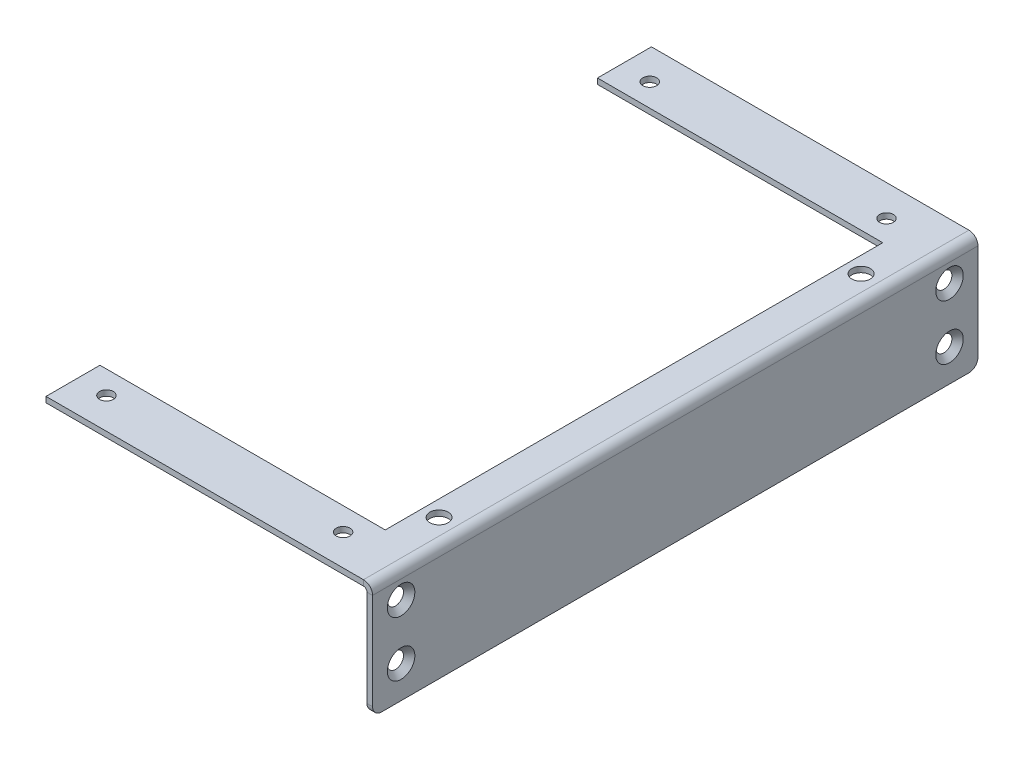
ISO-10303-21;
HEADER;
FILE_DESCRIPTION(('STEP AP214'),'2;1');
FILE_NAME('part.step','',(''),(''),'','','');
FILE_SCHEMA(('AUTOMOTIVE_DESIGN { 1 0 10303 214 1 1 1 1 }'));
ENDSEC;
DATA;
#1=APPLICATION_CONTEXT('core data for automotive mechanical design processes');
#2=APPLICATION_PROTOCOL_DEFINITION('international standard','automotive_design',2000,#1);
#3=PRODUCT_CONTEXT('',#1,'mechanical');
#4=PRODUCT('Part','Part','',(#3));
#5=PRODUCT_RELATED_PRODUCT_CATEGORY('part','',(#4));
#6=PRODUCT_DEFINITION_FORMATION('','',#4);
#7=PRODUCT_DEFINITION_CONTEXT('part definition',#1,'design');
#8=PRODUCT_DEFINITION('design','',#6,#7);
#9=PRODUCT_DEFINITION_SHAPE('','',#8);
#10=(LENGTH_UNIT() NAMED_UNIT(*) SI_UNIT(.MILLI.,.METRE.));
#11=(NAMED_UNIT(*) PLANE_ANGLE_UNIT() SI_UNIT($,.RADIAN.));
#12=(NAMED_UNIT(*) SI_UNIT($,.STERADIAN.) SOLID_ANGLE_UNIT());
#13=UNCERTAINTY_MEASURE_WITH_UNIT(LENGTH_MEASURE(1.E-05),#10,'distance_accuracy_value','');
#14=(GEOMETRIC_REPRESENTATION_CONTEXT(3) GLOBAL_UNCERTAINTY_ASSIGNED_CONTEXT((#13)) GLOBAL_UNIT_ASSIGNED_CONTEXT((#10,
#11,#12)) REPRESENTATION_CONTEXT('',''));
#15=CARTESIAN_POINT('',(0.,0.,0.));
#16=DIRECTION('',(0.,0.,1.));
#17=DIRECTION('',(1.,0.,0.));
#18=AXIS2_PLACEMENT_3D('',#15,#16,#17);
#19=CARTESIAN_POINT('',(71.2200000000001,-24.9792,-132.04));
#20=DIRECTION('',(0.,0.,-1.));
#21=DIRECTION('',(-1.,0.,0.));
#22=AXIS2_PLACEMENT_3D('',#19,#20,#21);
#23=PLANE('',#22);
#24=DIRECTION('',(0.,-1.,0.));
#25=VECTOR('',#24,1.);
#26=CARTESIAN_POINT('',(71.2200000000001,-24.9792,-132.04));
#27=LINE('',#26,#25);
#28=CARTESIAN_POINT('',(71.22,-1.9792,-132.04));
#29=VERTEX_POINT('',#28);
#30=CARTESIAN_POINT('',(71.2200000000001,-22.9992,-132.04));
#31=VERTEX_POINT('',#30);
#32=EDGE_CURVE('E179',#29,#31,#27,.T.);
#33=ORIENTED_EDGE('',*,*,#32,.T.);
#34=DIRECTION('',(1.,0.,0.));
#35=VECTOR('',#34,1.);
#36=CARTESIAN_POINT('',(-0.00100000000005651,-22.9992000000003,-132.04));
#37=LINE('',#36,#35);
#38=CARTESIAN_POINT('',(70.0008000000001,-22.9992,-132.04));
#39=VERTEX_POINT('',#38);
#40=EDGE_CURVE('E278',#39,#31,#37,.T.);
#41=ORIENTED_EDGE('',*,*,#40,.F.);
#42=DIRECTION('',(0.,1.,0.));
#43=VECTOR('',#42,1.);
#44=CARTESIAN_POINT('',(70.0008,2.4958991102842E-13,-132.04));
#45=LINE('',#44,#43);
#46=CARTESIAN_POINT('',(70.0008,-1.97920000000001,-132.04));
#47=VERTEX_POINT('',#46);
#48=EDGE_CURVE('E191',#47,#39,#45,.F.);
#49=ORIENTED_EDGE('',*,*,#48,.F.);
#50=DIRECTION('',(1.,0.,0.));
#51=VECTOR('',#50,1.);
#52=CARTESIAN_POINT('',(71.22,-1.9792,-132.04));
#53=LINE('',#52,#51);
#54=EDGE_CURVE('E202',#47,#29,#53,.T.);
#55=ORIENTED_EDGE('',*,*,#54,.T.);
#56=EDGE_LOOP('',(#33,#41,#49,#55));
#57=FACE_BOUND('',#56,.T.);
#58=ADVANCED_FACE('F58',(#57),#23,.T.);
#59=CARTESIAN_POINT('',(71.22,2.53846725076738E-13,0.));
#60=DIRECTION('',(1.,0.,0.));
#61=DIRECTION('',(0.,1.,0.));
#62=AXIS2_PLACEMENT_3D('',#59,#60,#61);
#63=PLANE('',#62);
#64=CARTESIAN_POINT('',(71.22,-5.9492,-6.22));
#65=DIRECTION('',(1.,0.,0.));
#66=DIRECTION('',(0.,0.,-1.));
#67=AXIS2_PLACEMENT_3D('',#64,#65,#66);
#68=CIRCLE('',#67,3.);
#69=CARTESIAN_POINT('',(71.22,-5.9492,-9.22));
#70=VERTEX_POINT('',#69);
#71=EDGE_CURVE('E348',#70,#70,#68,.T.);
#72=ORIENTED_EDGE('',*,*,#71,.F.);
#73=EDGE_LOOP('',(#72));
#74=FACE_BOUND('',#73,.T.);
#75=CARTESIAN_POINT('',(71.2200000000001,-17.9492,-6.21999999999999));
#76=DIRECTION('',(1.,0.,0.));
#77=DIRECTION('',(0.,0.,-1.));
#78=AXIS2_PLACEMENT_3D('',#75,#76,#77);
#79=CIRCLE('',#78,3.);
#80=CARTESIAN_POINT('',(71.2200000000001,-17.9492,-9.21999999999999));
#81=VERTEX_POINT('',#80);
#82=EDGE_CURVE('E342',#81,#81,#79,.T.);
#83=ORIENTED_EDGE('',*,*,#82,.F.);
#84=EDGE_LOOP('',(#83));
#85=FACE_BOUND('',#84,.T.);
#86=CARTESIAN_POINT('',(71.22,-5.9492,-125.82));
#87=DIRECTION('',(1.,0.,0.));
#88=DIRECTION('',(0.,0.,-1.));
#89=AXIS2_PLACEMENT_3D('',#86,#87,#88);
#90=CIRCLE('',#89,3.);
#91=CARTESIAN_POINT('',(71.22,-5.9492,-128.82));
#92=VERTEX_POINT('',#91);
#93=EDGE_CURVE('E339',#92,#92,#90,.T.);
#94=ORIENTED_EDGE('',*,*,#93,.F.);
#95=EDGE_LOOP('',(#94));
#96=FACE_BOUND('',#95,.T.);
#97=CARTESIAN_POINT('',(71.22,-17.9492,-125.82));
#98=DIRECTION('',(1.,0.,0.));
#99=DIRECTION('',(0.,0.,-1.));
#100=AXIS2_PLACEMENT_3D('',#97,#98,#99);
#101=CIRCLE('',#100,3.);
#102=CARTESIAN_POINT('',(71.22,-17.9492,-128.82));
#103=VERTEX_POINT('',#102);
#104=EDGE_CURVE('E331',#103,#103,#101,.T.);
#105=ORIENTED_EDGE('',*,*,#104,.F.);
#106=EDGE_LOOP('',(#105));
#107=FACE_BOUND('',#106,.T.);
#108=CARTESIAN_POINT('',(71.2200000000001,-22.9992,-1.98));
#109=DIRECTION('',(-1.,0.,0.));
#110=DIRECTION('',(0.,1.,0.));
#111=AXIS2_PLACEMENT_3D('',#108,#109,#110);
#112=CIRCLE('',#111,1.97999999999998);
#113=CARTESIAN_POINT('',(71.2200000000001,-24.9792,-1.98));
#114=VERTEX_POINT('',#113);
#115=CARTESIAN_POINT('',(71.2200000000001,-22.9992,0.));
#116=VERTEX_POINT('',#115);
#117=EDGE_CURVE('E161',#114,#116,#112,.T.);
#118=ORIENTED_EDGE('',*,*,#117,.F.);
#119=DIRECTION('',(0.,0.,1.));
#120=VECTOR('',#119,1.);
#121=CARTESIAN_POINT('',(71.2200000000001,-24.9792,0.));
#122=LINE('',#121,#120);
#123=CARTESIAN_POINT('',(71.2200000000001,-24.9792,-130.06));
#124=VERTEX_POINT('',#123);
#125=EDGE_CURVE('E173',#124,#114,#122,.T.);
#126=ORIENTED_EDGE('',*,*,#125,.F.);
#127=CARTESIAN_POINT('',(71.2200000000001,-22.9992,-130.06));
#128=DIRECTION('',(-1.,0.,0.));
#129=DIRECTION('',(0.,1.,0.));
#130=AXIS2_PLACEMENT_3D('',#127,#128,#129);
#131=CIRCLE('',#130,1.98000000000001);
#132=EDGE_CURVE('E75',#31,#124,#131,.T.);
#133=ORIENTED_EDGE('',*,*,#132,.F.);
#134=ORIENTED_EDGE('',*,*,#32,.F.);
#135=DIRECTION('',(0.,0.,1.));
#136=VECTOR('',#135,1.);
#137=CARTESIAN_POINT('',(71.22,-1.97920000000001,0.));
#138=LINE('',#137,#136);
#139=CARTESIAN_POINT('',(71.22,-1.97920000000001,0.));
#140=VERTEX_POINT('',#139);
#141=EDGE_CURVE('E194',#29,#140,#138,.T.);
#142=ORIENTED_EDGE('',*,*,#141,.T.);
#143=DIRECTION('',(0.,1.,0.));
#144=VECTOR('',#143,1.);
#145=CARTESIAN_POINT('',(71.22,-1.2192,0.));
#146=LINE('',#145,#144);
#147=EDGE_CURVE('E175',#116,#140,#146,.T.);
#148=ORIENTED_EDGE('',*,*,#147,.F.);
#149=EDGE_LOOP('',(#118,#126,#133,#134,#142,#148));
#150=FACE_BOUND('',#149,.T.);
#151=ADVANCED_FACE('F172',(#74,#85,#96,#107,#150),#63,.T.);
#152=CARTESIAN_POINT('',(70.0008,2.49589911028421E-13,0.));
#153=DIRECTION('',(1.,0.,0.));
#154=DIRECTION('',(0.,1.,0.));
#155=AXIS2_PLACEMENT_3D('',#152,#153,#154);
#156=PLANE('',#155);
#157=CARTESIAN_POINT('',(70.0008,-5.9492,-6.22));
#158=DIRECTION('',(1.,0.,0.));
#159=DIRECTION('',(0.,1.,0.));
#160=AXIS2_PLACEMENT_3D('',#157,#158,#159);
#161=CIRCLE('',#160,1.73748144142652);
#162=CARTESIAN_POINT('',(70.0008,-4.21171855857348,-6.22));
#163=VERTEX_POINT('',#162);
#164=EDGE_CURVE('E345',#163,#163,#161,.T.);
#165=ORIENTED_EDGE('',*,*,#164,.T.);
#166=EDGE_LOOP('',(#165));
#167=FACE_BOUND('',#166,.T.);
#168=CARTESIAN_POINT('',(70.0008000000001,-17.9492,-6.21999999999999));
#169=DIRECTION('',(1.,0.,0.));
#170=DIRECTION('',(0.,1.,0.));
#171=AXIS2_PLACEMENT_3D('',#168,#169,#170);
#172=CIRCLE('',#171,1.7374814414265);
#173=CARTESIAN_POINT('',(70.0008000000001,-16.2117185585735,-6.21999999999999));
#174=VERTEX_POINT('',#173);
#175=EDGE_CURVE('E62',#174,#174,#172,.T.);
#176=ORIENTED_EDGE('',*,*,#175,.T.);
#177=EDGE_LOOP('',(#176));
#178=FACE_BOUND('',#177,.T.);
#179=CARTESIAN_POINT('',(70.0008,-5.9492,-125.82));
#180=DIRECTION('',(1.,0.,0.));
#181=DIRECTION('',(0.,1.,0.));
#182=AXIS2_PLACEMENT_3D('',#179,#180,#181);
#183=CIRCLE('',#182,1.73748144142653);
#184=CARTESIAN_POINT('',(70.0008,-4.21171855857347,-125.82));
#185=VERTEX_POINT('',#184);
#186=EDGE_CURVE('E336',#185,#185,#183,.T.);
#187=ORIENTED_EDGE('',*,*,#186,.T.);
#188=EDGE_LOOP('',(#187));
#189=FACE_BOUND('',#188,.T.);
#190=CARTESIAN_POINT('',(70.0008,-17.9492,-125.82));
#191=DIRECTION('',(1.,0.,0.));
#192=DIRECTION('',(0.,1.,0.));
#193=AXIS2_PLACEMENT_3D('',#190,#191,#192);
#194=CIRCLE('',#193,1.73748144142653);
#195=CARTESIAN_POINT('',(70.0008,-16.2117185585735,-125.82));
#196=VERTEX_POINT('',#195);
#197=EDGE_CURVE('E327',#196,#196,#194,.T.);
#198=ORIENTED_EDGE('',*,*,#197,.T.);
#199=EDGE_LOOP('',(#198));
#200=FACE_BOUND('',#199,.T.);
#201=DIRECTION('',(0.,0.,-1.));
#202=VECTOR('',#201,1.);
#203=CARTESIAN_POINT('',(70.0008000000001,-24.9792,0.));
#204=LINE('',#203,#202);
#205=CARTESIAN_POINT('',(70.0008000000001,-24.9792,-130.06));
#206=VERTEX_POINT('',#205);
#207=CARTESIAN_POINT('',(70.0008000000001,-24.9792,-1.98));
#208=VERTEX_POINT('',#207);
#209=EDGE_CURVE('E189',#206,#208,#204,.F.);
#210=ORIENTED_EDGE('',*,*,#209,.T.);
#211=CARTESIAN_POINT('',(70.0008000000001,-22.9992,-1.98));
#212=DIRECTION('',(1.,0.,0.));
#213=DIRECTION('',(0.,1.,0.));
#214=AXIS2_PLACEMENT_3D('',#211,#212,#213);
#215=CIRCLE('',#214,1.97999999999998);
#216=CARTESIAN_POINT('',(70.0008000000001,-22.9992,0.));
#217=VERTEX_POINT('',#216);
#218=EDGE_CURVE('E83',#217,#208,#215,.T.);
#219=ORIENTED_EDGE('',*,*,#218,.F.);
#220=DIRECTION('',(0.,-1.,0.));
#221=VECTOR('',#220,1.);
#222=CARTESIAN_POINT('',(70.0008,2.49589911028421E-13,0.));
#223=LINE('',#222,#221);
#224=CARTESIAN_POINT('',(70.0008,-1.97920000000001,0.));
#225=VERTEX_POINT('',#224);
#226=EDGE_CURVE('E184',#217,#225,#223,.F.);
#227=ORIENTED_EDGE('',*,*,#226,.T.);
#228=DIRECTION('',(0.,0.,-1.));
#229=VECTOR('',#228,1.);
#230=CARTESIAN_POINT('',(70.0008,-1.9792,-132.04));
#231=LINE('',#230,#229);
#232=EDGE_CURVE('E199',#47,#225,#231,.F.);
#233=ORIENTED_EDGE('',*,*,#232,.F.);
#234=ORIENTED_EDGE('',*,*,#48,.T.);
#235=CARTESIAN_POINT('',(70.0008000000001,-22.9992,-130.06));
#236=DIRECTION('',(1.,0.,0.));
#237=DIRECTION('',(0.,1.,0.));
#238=AXIS2_PLACEMENT_3D('',#235,#236,#237);
#239=CIRCLE('',#238,1.98000000000001);
#240=EDGE_CURVE('E283',#206,#39,#239,.T.);
#241=ORIENTED_EDGE('',*,*,#240,.F.);
#242=EDGE_LOOP('',(#210,#219,#227,#233,#234,#241));
#243=FACE_BOUND('',#242,.T.);
#244=ADVANCED_FACE('F282',(#167,#178,#189,#200,#243),#156,.F.);
#245=CARTESIAN_POINT('',(71.2200000000001,-24.9792,0.));
#246=DIRECTION('',(0.,-1.,0.));
#247=DIRECTION('',(1.,0.,0.));
#248=AXIS2_PLACEMENT_3D('',#245,#246,#247);
#249=PLANE('',#248);
#250=ORIENTED_EDGE('',*,*,#125,.T.);
#251=DIRECTION('',(1.,0.,0.));
#252=VECTOR('',#251,1.);
#253=CARTESIAN_POINT('',(-0.00100000000002876,-24.9792000000003,-1.97999999999998));
#254=LINE('',#253,#252);
#255=EDGE_CURVE('E158',#208,#114,#254,.T.);
#256=ORIENTED_EDGE('',*,*,#255,.F.);
#257=ORIENTED_EDGE('',*,*,#209,.F.);
#258=DIRECTION('',(1.,0.,0.));
#259=VECTOR('',#258,1.);
#260=CARTESIAN_POINT('',(-0.00100000000005651,-24.9792000000003,-130.06));
#261=LINE('',#260,#259);
#262=EDGE_CURVE('E178',#206,#124,#261,.T.);
#263=ORIENTED_EDGE('',*,*,#262,.T.);
#264=EDGE_LOOP('',(#250,#256,#257,#263));
#265=FACE_BOUND('',#264,.T.);
#266=ADVANCED_FACE('F177',(#265),#249,.T.);
#267=CARTESIAN_POINT('',(0.,0.,0.));
#268=DIRECTION('',(0.,-1.,0.));
#269=DIRECTION('',(0.,0.,-1.));
#270=AXIS2_PLACEMENT_3D('',#267,#268,#269);
#271=PLANE('',#270);
#272=CARTESIAN_POINT('',(65.72,0.,-112.04));
#273=DIRECTION('',(0.,1.,0.));
#274=DIRECTION('',(0.,0.,1.));
#275=AXIS2_PLACEMENT_3D('',#272,#273,#274);
#276=CIRCLE('',#275,1.99999999999999);
#277=CARTESIAN_POINT('',(65.72,0.,-110.04));
#278=VERTEX_POINT('',#277);
#279=EDGE_CURVE('E390',#278,#278,#276,.T.);
#280=ORIENTED_EDGE('',*,*,#279,.F.);
#281=EDGE_LOOP('',(#280));
#282=FACE_BOUND('',#281,.T.);
#283=CARTESIAN_POINT('',(65.72,0.,-20.));
#284=DIRECTION('',(0.,1.,0.));
#285=DIRECTION('',(0.,0.,1.));
#286=AXIS2_PLACEMENT_3D('',#283,#284,#285);
#287=CIRCLE('',#286,1.99999999999999);
#288=CARTESIAN_POINT('',(65.72,0.,-18.));
#289=VERTEX_POINT('',#288);
#290=EDGE_CURVE('E384',#289,#289,#287,.T.);
#291=ORIENTED_EDGE('',*,*,#290,.F.);
#292=EDGE_LOOP('',(#291));
#293=FACE_BOUND('',#292,.T.);
#294=CARTESIAN_POINT('',(6.40999999999997,0.,-125.27));
#295=DIRECTION('',(0.,1.,0.));
#296=DIRECTION('',(0.,0.,1.));
#297=AXIS2_PLACEMENT_3D('',#294,#295,#296);
#298=CIRCLE('',#297,1.49999999999999);
#299=CARTESIAN_POINT('',(6.40999999999997,0.,-123.77));
#300=VERTEX_POINT('',#299);
#301=EDGE_CURVE('E372',#300,#300,#298,.T.);
#302=ORIENTED_EDGE('',*,*,#301,.F.);
#303=EDGE_LOOP('',(#302));
#304=FACE_BOUND('',#303,.T.);
#305=CARTESIAN_POINT('',(58.03,0.,-6.77));
#306=DIRECTION('',(0.,1.,0.));
#307=DIRECTION('',(0.,0.,1.));
#308=AXIS2_PLACEMENT_3D('',#305,#306,#307);
#309=CIRCLE('',#308,1.49999999999999);
#310=CARTESIAN_POINT('',(58.03,0.,-5.27000000000001));
#311=VERTEX_POINT('',#310);
#312=EDGE_CURVE('E360',#311,#311,#309,.T.);
#313=ORIENTED_EDGE('',*,*,#312,.F.);
#314=EDGE_LOOP('',(#313));
#315=FACE_BOUND('',#314,.T.);
#316=CARTESIAN_POINT('',(6.40999999999999,0.,-6.77));
#317=DIRECTION('',(0.,1.,0.));
#318=DIRECTION('',(0.,0.,1.));
#319=AXIS2_PLACEMENT_3D('',#316,#317,#318);
#320=CIRCLE('',#319,1.49999999999999);
#321=CARTESIAN_POINT('',(6.40999999999999,0.,-5.27000000000001));
#322=VERTEX_POINT('',#321);
#323=EDGE_CURVE('E354',#322,#322,#320,.T.);
#324=ORIENTED_EDGE('',*,*,#323,.F.);
#325=EDGE_LOOP('',(#324));
#326=FACE_BOUND('',#325,.T.);
#327=DIRECTION('',(0.,0.,1.));
#328=VECTOR('',#327,1.);
#329=CARTESIAN_POINT('',(0.,0.,0.));
#330=LINE('',#329,#328);
#331=CARTESIAN_POINT('',(0.,0.,-132.04));
#332=VERTEX_POINT('',#331);
#333=CARTESIAN_POINT('',(0.,0.,-120.27));
#334=VERTEX_POINT('',#333);
#335=EDGE_CURVE('E237',#332,#334,#330,.T.);
#336=ORIENTED_EDGE('',*,*,#335,.T.);
#337=DIRECTION('',(-1.,0.,0.));
#338=VECTOR('',#337,1.);
#339=CARTESIAN_POINT('',(0.,0.,-120.27));
#340=LINE('',#339,#338);
#341=CARTESIAN_POINT('',(62.22,0.,-120.27));
#342=VERTEX_POINT('',#341);
#343=EDGE_CURVE('E301',#342,#334,#340,.T.);
#344=ORIENTED_EDGE('',*,*,#343,.F.);
#345=DIRECTION('',(0.,0.,-1.));
#346=VECTOR('',#345,1.);
#347=CARTESIAN_POINT('',(62.22,0.,-120.27));
#348=LINE('',#347,#346);
#349=CARTESIAN_POINT('',(62.22,0.,-11.77));
#350=VERTEX_POINT('',#349);
#351=EDGE_CURVE('E303',#350,#342,#348,.T.);
#352=ORIENTED_EDGE('',*,*,#351,.F.);
#353=DIRECTION('',(1.,0.,0.));
#354=VECTOR('',#353,1.);
#355=CARTESIAN_POINT('',(0.,0.,-11.77));
#356=LINE('',#355,#354);
#357=CARTESIAN_POINT('',(0.,0.,-11.77));
#358=VERTEX_POINT('',#357);
#359=EDGE_CURVE('E309',#358,#350,#356,.T.);
#360=ORIENTED_EDGE('',*,*,#359,.F.);
#361=CARTESIAN_POINT('',(0.,0.,0.));
#362=VERTEX_POINT('',#361);
#363=EDGE_CURVE('E226',#358,#362,#330,.T.);
#364=ORIENTED_EDGE('',*,*,#363,.T.);
#365=DIRECTION('',(1.,0.,0.));
#366=VECTOR('',#365,1.);
#367=CARTESIAN_POINT('',(0.,0.,0.));
#368=LINE('',#367,#366);
#369=CARTESIAN_POINT('',(69.2408,0.,0.));
#370=VERTEX_POINT('',#369);
#371=EDGE_CURVE('E240',#362,#370,#368,.T.);
#372=ORIENTED_EDGE('',*,*,#371,.T.);
#373=DIRECTION('',(0.,0.,1.));
#374=VECTOR('',#373,1.);
#375=CARTESIAN_POINT('',(69.2408,0.,0.));
#376=LINE('',#375,#374);
#377=CARTESIAN_POINT('',(69.2408,0.,-132.04));
#378=VERTEX_POINT('',#377);
#379=EDGE_CURVE('E206',#370,#378,#376,.F.);
#380=ORIENTED_EDGE('',*,*,#379,.T.);
#381=DIRECTION('',(-1.,0.,0.));
#382=VECTOR('',#381,1.);
#383=CARTESIAN_POINT('',(0.,0.,-132.04));
#384=LINE('',#383,#382);
#385=EDGE_CURVE('E243',#378,#332,#384,.T.);
#386=ORIENTED_EDGE('',*,*,#385,.T.);
#387=EDGE_LOOP('',(#336,#344,#352,#360,#364,#372,#380,#386));
#388=FACE_BOUND('',#387,.T.);
#389=CARTESIAN_POINT('',(58.03,0.,-125.27));
#390=DIRECTION('',(0.,1.,0.));
#391=DIRECTION('',(0.,0.,1.));
#392=AXIS2_PLACEMENT_3D('',#389,#390,#391);
#393=CIRCLE('',#392,1.49999999999999);
#394=CARTESIAN_POINT('',(58.03,0.,-123.77));
#395=VERTEX_POINT('',#394);
#396=EDGE_CURVE('E366',#395,#395,#393,.T.);
#397=ORIENTED_EDGE('',*,*,#396,.F.);
#398=EDGE_LOOP('',(#397));
#399=FACE_BOUND('',#398,.T.);
#400=ADVANCED_FACE('F257',(#282,#293,#304,#315,#326,#388,#399),#271,.F.);
#401=CARTESIAN_POINT('',(0.,-1.2192,0.));
#402=DIRECTION('',(-1.,0.,0.));
#403=DIRECTION('',(0.,0.,1.));
#404=AXIS2_PLACEMENT_3D('',#401,#402,#403);
#405=PLANE('',#404);
#406=DIRECTION('',(0.,1.,0.));
#407=VECTOR('',#406,1.);
#408=CARTESIAN_POINT('',(0.,-24.9802,-120.27));
#409=LINE('',#408,#407);
#410=CARTESIAN_POINT('',(0.,-1.2192,-120.27));
#411=VERTEX_POINT('',#410);
#412=EDGE_CURVE('E298',#411,#334,#409,.T.);
#413=ORIENTED_EDGE('',*,*,#412,.T.);
#414=ORIENTED_EDGE('',*,*,#335,.F.);
#415=DIRECTION('',(0.,1.,0.));
#416=VECTOR('',#415,1.);
#417=CARTESIAN_POINT('',(0.,-1.2192,-132.04));
#418=LINE('',#417,#416);
#419=CARTESIAN_POINT('',(0.,-1.2192,-132.04));
#420=VERTEX_POINT('',#419);
#421=EDGE_CURVE('E13',#420,#332,#418,.T.);
#422=ORIENTED_EDGE('',*,*,#421,.F.);
#423=DIRECTION('',(0.,0.,1.));
#424=VECTOR('',#423,1.);
#425=CARTESIAN_POINT('',(0.,-1.2192,0.));
#426=LINE('',#425,#424);
#427=EDGE_CURVE('E228',#420,#411,#426,.T.);
#428=ORIENTED_EDGE('',*,*,#427,.T.);
#429=EDGE_LOOP('',(#413,#414,#422,#428));
#430=FACE_BOUND('',#429,.T.);
#431=ADVANCED_FACE('F297',(#430),#405,.T.);
#432=CARTESIAN_POINT('',(0.,-1.2192,0.));
#433=DIRECTION('',(0.,0.,1.));
#434=DIRECTION('',(1.,0.,0.));
#435=AXIS2_PLACEMENT_3D('',#432,#433,#434);
#436=PLANE('',#435);
#437=DIRECTION('',(1.,0.,0.));
#438=VECTOR('',#437,1.);
#439=CARTESIAN_POINT('',(0.,-1.2192,0.));
#440=LINE('',#439,#438);
#441=CARTESIAN_POINT('',(0.,-1.2192,0.));
#442=VERTEX_POINT('',#441);
#443=CARTESIAN_POINT('',(69.2408,-1.2192,0.));
#444=VERTEX_POINT('',#443);
#445=EDGE_CURVE('E231',#442,#444,#440,.T.);
#446=ORIENTED_EDGE('',*,*,#445,.T.);
#447=DIRECTION('',(0.,1.,0.));
#448=VECTOR('',#447,1.);
#449=CARTESIAN_POINT('',(69.2408,-1.21920000000003,0.));
#450=LINE('',#449,#448);
#451=EDGE_CURVE('E212',#444,#370,#450,.T.);
#452=ORIENTED_EDGE('',*,*,#451,.T.);
#453=ORIENTED_EDGE('',*,*,#371,.F.);
#454=DIRECTION('',(0.,1.,0.));
#455=VECTOR('',#454,1.);
#456=CARTESIAN_POINT('',(0.,-1.2192,0.));
#457=LINE('',#456,#455);
#458=EDGE_CURVE('E67',#442,#362,#457,.T.);
#459=ORIENTED_EDGE('',*,*,#458,.F.);
#460=EDGE_LOOP('',(#446,#452,#453,#459));
#461=FACE_BOUND('',#460,.T.);
#462=ADVANCED_FACE('F253',(#461),#436,.T.);
#463=CARTESIAN_POINT('',(0.,-1.2192,0.));
#464=DIRECTION('',(0.,-1.,0.));
#465=DIRECTION('',(0.,0.,-1.));
#466=AXIS2_PLACEMENT_3D('',#463,#464,#465);
#467=PLANE('',#466);
#468=CARTESIAN_POINT('',(65.72,-1.2192,-112.04));
#469=DIRECTION('',(0.,-1.,0.));
#470=DIRECTION('',(0.,0.,-1.));
#471=AXIS2_PLACEMENT_3D('',#468,#469,#470);
#472=CIRCLE('',#471,1.99999999999999);
#473=CARTESIAN_POINT('',(65.72,-1.2192,-114.04));
#474=VERTEX_POINT('',#473);
#475=EDGE_CURVE('E387',#474,#474,#472,.T.);
#476=ORIENTED_EDGE('',*,*,#475,.F.);
#477=EDGE_LOOP('',(#476));
#478=FACE_BOUND('',#477,.T.);
#479=CARTESIAN_POINT('',(65.72,-1.2192,-20.));
#480=DIRECTION('',(0.,-1.,0.));
#481=DIRECTION('',(0.,0.,-1.));
#482=AXIS2_PLACEMENT_3D('',#479,#480,#481);
#483=CIRCLE('',#482,1.99999999999999);
#484=CARTESIAN_POINT('',(65.72,-1.2192,-22.));
#485=VERTEX_POINT('',#484);
#486=EDGE_CURVE('E378',#485,#485,#483,.T.);
#487=ORIENTED_EDGE('',*,*,#486,.F.);
#488=EDGE_LOOP('',(#487));
#489=FACE_BOUND('',#488,.T.);
#490=CARTESIAN_POINT('',(6.40999999999997,-1.2192,-125.27));
#491=DIRECTION('',(0.,-1.,0.));
#492=DIRECTION('',(0.,0.,-1.));
#493=AXIS2_PLACEMENT_3D('',#490,#491,#492);
#494=CIRCLE('',#493,1.5);
#495=CARTESIAN_POINT('',(6.40999999999997,-1.2192,-126.77));
#496=VERTEX_POINT('',#495);
#497=EDGE_CURVE('E369',#496,#496,#494,.T.);
#498=ORIENTED_EDGE('',*,*,#497,.F.);
#499=EDGE_LOOP('',(#498));
#500=FACE_BOUND('',#499,.T.);
#501=CARTESIAN_POINT('',(58.03,-1.2192,-125.27));
#502=DIRECTION('',(0.,-1.,0.));
#503=DIRECTION('',(0.,0.,-1.));
#504=AXIS2_PLACEMENT_3D('',#501,#502,#503);
#505=CIRCLE('',#504,1.5);
#506=CARTESIAN_POINT('',(58.03,-1.2192,-126.77));
#507=VERTEX_POINT('',#506);
#508=EDGE_CURVE('E363',#507,#507,#505,.T.);
#509=ORIENTED_EDGE('',*,*,#508,.F.);
#510=EDGE_LOOP('',(#509));
#511=FACE_BOUND('',#510,.T.);
#512=CARTESIAN_POINT('',(58.03,-1.2192,-6.77));
#513=DIRECTION('',(0.,-1.,0.));
#514=DIRECTION('',(0.,0.,-1.));
#515=AXIS2_PLACEMENT_3D('',#512,#513,#514);
#516=CIRCLE('',#515,1.5);
#517=CARTESIAN_POINT('',(58.03,-1.2192,-8.27));
#518=VERTEX_POINT('',#517);
#519=EDGE_CURVE('E357',#518,#518,#516,.T.);
#520=ORIENTED_EDGE('',*,*,#519,.F.);
#521=EDGE_LOOP('',(#520));
#522=FACE_BOUND('',#521,.T.);
#523=CARTESIAN_POINT('',(6.40999999999999,-1.2192,-6.77));
#524=DIRECTION('',(0.,-1.,0.));
#525=DIRECTION('',(0.,0.,-1.));
#526=AXIS2_PLACEMENT_3D('',#523,#524,#525);
#527=CIRCLE('',#526,1.5);
#528=CARTESIAN_POINT('',(6.40999999999999,-1.2192,-8.27));
#529=VERTEX_POINT('',#528);
#530=EDGE_CURVE('E351',#529,#529,#527,.T.);
#531=ORIENTED_EDGE('',*,*,#530,.F.);
#532=EDGE_LOOP('',(#531));
#533=FACE_BOUND('',#532,.T.);
#534=DIRECTION('',(-1.,0.,0.));
#535=VECTOR('',#534,1.);
#536=CARTESIAN_POINT('',(0.,-1.2192,-120.27));
#537=LINE('',#536,#535);
#538=CARTESIAN_POINT('',(62.22,-1.2192,-120.27));
#539=VERTEX_POINT('',#538);
#540=EDGE_CURVE('E326',#539,#411,#537,.T.);
#541=ORIENTED_EDGE('',*,*,#540,.T.);
#542=ORIENTED_EDGE('',*,*,#427,.F.);
#543=DIRECTION('',(-1.,0.,0.));
#544=VECTOR('',#543,1.);
#545=CARTESIAN_POINT('',(0.,-1.2192,-132.04));
#546=LINE('',#545,#544);
#547=CARTESIAN_POINT('',(69.2408,-1.2192,-132.04));
#548=VERTEX_POINT('',#547);
#549=EDGE_CURVE('E235',#548,#420,#546,.T.);
#550=ORIENTED_EDGE('',*,*,#549,.F.);
#551=DIRECTION('',(0.,0.,1.));
#552=VECTOR('',#551,1.);
#553=CARTESIAN_POINT('',(69.2408,-1.21920000000003,0.));
#554=LINE('',#553,#552);
#555=EDGE_CURVE('E218',#444,#548,#554,.F.);
#556=ORIENTED_EDGE('',*,*,#555,.F.);
#557=ORIENTED_EDGE('',*,*,#445,.F.);
#558=CARTESIAN_POINT('',(0.,-1.2192,-11.77));
#559=VERTEX_POINT('',#558);
#560=EDGE_CURVE('E232',#559,#442,#426,.T.);
#561=ORIENTED_EDGE('',*,*,#560,.F.);
#562=DIRECTION('',(1.,0.,0.));
#563=VECTOR('',#562,1.);
#564=CARTESIAN_POINT('',(0.,-1.2192,-11.77));
#565=LINE('',#564,#563);
#566=CARTESIAN_POINT('',(62.22,-1.2192,-11.77));
#567=VERTEX_POINT('',#566);
#568=EDGE_CURVE('E205',#559,#567,#565,.T.);
#569=ORIENTED_EDGE('',*,*,#568,.T.);
#570=DIRECTION('',(0.,0.,-1.));
#571=VECTOR('',#570,1.);
#572=CARTESIAN_POINT('',(62.22,-1.2192,-120.27));
#573=LINE('',#572,#571);
#574=EDGE_CURVE('E318',#567,#539,#573,.T.);
#575=ORIENTED_EDGE('',*,*,#574,.T.);
#576=EDGE_LOOP('',(#541,#542,#550,#556,#557,#561,#569,#575));
#577=FACE_BOUND('',#576,.T.);
#578=ADVANCED_FACE('F289',(#478,#489,#500,#511,#522,#533,#577),#467,.T.);
#579=DIRECTION('',(0.,1.,0.));
#580=VECTOR('',#579,1.);
#581=CARTESIAN_POINT('',(0.,-24.9802,-11.77));
#582=LINE('',#581,#580);
#583=EDGE_CURVE('E305',#559,#358,#582,.T.);
#584=ORIENTED_EDGE('',*,*,#583,.F.);
#585=ORIENTED_EDGE('',*,*,#560,.T.);
#586=ORIENTED_EDGE('',*,*,#458,.T.);
#587=ORIENTED_EDGE('',*,*,#363,.F.);
#588=EDGE_LOOP('',(#584,#585,#586,#587));
#589=FACE_BOUND('',#588,.T.);
#590=ADVANCED_FACE('F60',(#589),#405,.T.);
#591=CARTESIAN_POINT('',(0.,-1.2192,-132.04));
#592=DIRECTION('',(0.,0.,-1.));
#593=DIRECTION('',(-1.,0.,0.));
#594=AXIS2_PLACEMENT_3D('',#591,#592,#593);
#595=PLANE('',#594);
#596=DIRECTION('',(0.,1.,0.));
#597=VECTOR('',#596,1.);
#598=CARTESIAN_POINT('',(69.2408,-1.21920000000003,-132.04));
#599=LINE('',#598,#597);
#600=EDGE_CURVE('E223',#548,#378,#599,.T.);
#601=ORIENTED_EDGE('',*,*,#600,.F.);
#602=ORIENTED_EDGE('',*,*,#549,.T.);
#603=ORIENTED_EDGE('',*,*,#421,.T.);
#604=ORIENTED_EDGE('',*,*,#385,.F.);
#605=EDGE_LOOP('',(#601,#602,#603,#604));
#606=FACE_BOUND('',#605,.T.);
#607=ADVANCED_FACE('F293',(#606),#595,.T.);
#608=CARTESIAN_POINT('',(69.2408,-1.97920000000001,-132.04));
#609=DIRECTION('',(0.,0.,-1.));
#610=DIRECTION('',(-1.,0.,0.));
#611=AXIS2_PLACEMENT_3D('',#608,#609,#610);
#612=PLANE('',#611);
#613=ORIENTED_EDGE('',*,*,#54,.F.);
#614=CARTESIAN_POINT('',(69.2408,-1.97920000000001,-132.04));
#615=DIRECTION('',(0.,0.,1.));
#616=DIRECTION('',(1.,0.,0.));
#617=AXIS2_PLACEMENT_3D('',#614,#615,#616);
#618=CIRCLE('',#617,0.759999999999983);
#619=EDGE_CURVE('E215',#548,#47,#618,.F.);
#620=ORIENTED_EDGE('',*,*,#619,.F.);
#621=ORIENTED_EDGE('',*,*,#600,.T.);
#622=CARTESIAN_POINT('',(69.2408,-1.97920000000001,-132.04));
#623=DIRECTION('',(0.,0.,1.));
#624=DIRECTION('',(1.,0.,0.));
#625=AXIS2_PLACEMENT_3D('',#622,#623,#624);
#626=CIRCLE('',#625,1.97919999999998);
#627=EDGE_CURVE('E208',#378,#29,#626,.F.);
#628=ORIENTED_EDGE('',*,*,#627,.T.);
#629=EDGE_LOOP('',(#613,#620,#621,#628));
#630=FACE_BOUND('',#629,.T.);
#631=ADVANCED_FACE('F273',(#630),#612,.T.);
#632=CARTESIAN_POINT('',(69.2408,-1.97920000000001,0.));
#633=DIRECTION('',(0.,0.,-1.));
#634=DIRECTION('',(-1.,0.,0.));
#635=AXIS2_PLACEMENT_3D('',#632,#633,#634);
#636=PLANE('',#635);
#637=CARTESIAN_POINT('',(69.2408,-1.97920000000001,0.));
#638=DIRECTION('',(0.,0.,1.));
#639=DIRECTION('',(1.,0.,0.));
#640=AXIS2_PLACEMENT_3D('',#637,#638,#639);
#641=CIRCLE('',#640,0.759999999999983);
#642=EDGE_CURVE('E181',#225,#444,#641,.T.);
#643=ORIENTED_EDGE('',*,*,#642,.F.);
#644=DIRECTION('',(1.,0.,0.));
#645=VECTOR('',#644,1.);
#646=CARTESIAN_POINT('',(70.0008,-1.97920000000001,0.));
#647=LINE('',#646,#645);
#648=EDGE_CURVE('E196',#225,#140,#647,.T.);
#649=ORIENTED_EDGE('',*,*,#648,.T.);
#650=CARTESIAN_POINT('',(69.2408,-1.97920000000001,0.));
#651=DIRECTION('',(0.,0.,1.));
#652=DIRECTION('',(1.,0.,0.));
#653=AXIS2_PLACEMENT_3D('',#650,#651,#652);
#654=CIRCLE('',#653,1.97919999999998);
#655=EDGE_CURVE('E209',#140,#370,#654,.T.);
#656=ORIENTED_EDGE('',*,*,#655,.T.);
#657=ORIENTED_EDGE('',*,*,#451,.F.);
#658=EDGE_LOOP('',(#643,#649,#656,#657));
#659=FACE_BOUND('',#658,.T.);
#660=ADVANCED_FACE('F267',(#659),#636,.F.);
#661=CARTESIAN_POINT('',(69.2408,-1.97920000000001,0.));
#662=DIRECTION('',(0.,0.,1.));
#663=DIRECTION('',(1.,0.,0.));
#664=AXIS2_PLACEMENT_3D('',#661,#662,#663);
#665=CYLINDRICAL_SURFACE('',#664,1.97919999999998);
#666=ORIENTED_EDGE('',*,*,#379,.F.);
#667=ORIENTED_EDGE('',*,*,#655,.F.);
#668=ORIENTED_EDGE('',*,*,#141,.F.);
#669=ORIENTED_EDGE('',*,*,#627,.F.);
#670=EDGE_LOOP('',(#666,#667,#668,#669));
#671=FACE_BOUND('',#670,.T.);
#672=ADVANCED_FACE('F264',(#671),#665,.T.);
#673=CARTESIAN_POINT('',(69.2408,-1.97920000000001,0.));
#674=DIRECTION('',(0.,0.,1.));
#675=DIRECTION('',(1.,0.,0.));
#676=AXIS2_PLACEMENT_3D('',#673,#674,#675);
#677=CYLINDRICAL_SURFACE('',#676,0.759999999999983);
#678=ORIENTED_EDGE('',*,*,#555,.T.);
#679=ORIENTED_EDGE('',*,*,#619,.T.);
#680=ORIENTED_EDGE('',*,*,#232,.T.);
#681=ORIENTED_EDGE('',*,*,#642,.T.);
#682=EDGE_LOOP('',(#678,#679,#680,#681));
#683=FACE_BOUND('',#682,.T.);
#684=ADVANCED_FACE('F285',(#683),#677,.F.);
#685=CARTESIAN_POINT('',(71.22,-1.2192,0.));
#686=DIRECTION('',(0.,0.,1.));
#687=DIRECTION('',(1.,0.,0.));
#688=AXIS2_PLACEMENT_3D('',#685,#686,#687);
#689=PLANE('',#688);
#690=DIRECTION('',(1.,0.,0.));
#691=VECTOR('',#690,1.);
#692=CARTESIAN_POINT('',(-0.00100000000002876,-22.9992000000003,0.));
#693=LINE('',#692,#691);
#694=EDGE_CURVE('E167',#217,#116,#693,.T.);
#695=ORIENTED_EDGE('',*,*,#694,.T.);
#696=ORIENTED_EDGE('',*,*,#147,.T.);
#697=ORIENTED_EDGE('',*,*,#648,.F.);
#698=ORIENTED_EDGE('',*,*,#226,.F.);
#699=EDGE_LOOP('',(#695,#696,#697,#698));
#700=FACE_BOUND('',#699,.T.);
#701=ADVANCED_FACE('F440',(#700),#689,.T.);
#702=CARTESIAN_POINT('',(0.,-24.9802,-120.27));
#703=DIRECTION('',(0.,0.,-1.));
#704=DIRECTION('',(-1.,0.,0.));
#705=AXIS2_PLACEMENT_3D('',#702,#703,#704);
#706=PLANE('',#705);
#707=DIRECTION('',(0.,1.,0.));
#708=VECTOR('',#707,1.);
#709=CARTESIAN_POINT('',(62.22,-24.9802,-120.27));
#710=LINE('',#709,#708);
#711=EDGE_CURVE('E314',#539,#342,#710,.T.);
#712=ORIENTED_EDGE('',*,*,#711,.T.);
#713=ORIENTED_EDGE('',*,*,#343,.T.);
#714=ORIENTED_EDGE('',*,*,#412,.F.);
#715=ORIENTED_EDGE('',*,*,#540,.F.);
#716=EDGE_LOOP('',(#712,#713,#714,#715));
#717=FACE_BOUND('',#716,.T.);
#718=ADVANCED_FACE('F463',(#717),#706,.F.);
#719=CARTESIAN_POINT('',(62.22,-24.9802,-120.27));
#720=DIRECTION('',(1.,0.,0.));
#721=DIRECTION('',(0.,0.,-1.));
#722=AXIS2_PLACEMENT_3D('',#719,#720,#721);
#723=PLANE('',#722);
#724=DIRECTION('',(0.,1.,0.));
#725=VECTOR('',#724,1.);
#726=CARTESIAN_POINT('',(62.22,-24.9802,-11.77));
#727=LINE('',#726,#725);
#728=EDGE_CURVE('E307',#567,#350,#727,.T.);
#729=ORIENTED_EDGE('',*,*,#728,.T.);
#730=ORIENTED_EDGE('',*,*,#351,.T.);
#731=ORIENTED_EDGE('',*,*,#711,.F.);
#732=ORIENTED_EDGE('',*,*,#574,.F.);
#733=EDGE_LOOP('',(#729,#730,#731,#732));
#734=FACE_BOUND('',#733,.T.);
#735=ADVANCED_FACE('F324',(#734),#723,.F.);
#736=CARTESIAN_POINT('',(0.,-24.9802,-11.77));
#737=DIRECTION('',(0.,0.,1.));
#738=DIRECTION('',(1.,0.,0.));
#739=AXIS2_PLACEMENT_3D('',#736,#737,#738);
#740=PLANE('',#739);
#741=ORIENTED_EDGE('',*,*,#583,.T.);
#742=ORIENTED_EDGE('',*,*,#359,.T.);
#743=ORIENTED_EDGE('',*,*,#728,.F.);
#744=ORIENTED_EDGE('',*,*,#568,.F.);
#745=EDGE_LOOP('',(#741,#742,#743,#744));
#746=FACE_BOUND('',#745,.T.);
#747=ADVANCED_FACE('F321',(#746),#740,.F.);
#748=CARTESIAN_POINT('',(71.22,-17.9492,-125.82));
#749=DIRECTION('',(1.,0.,0.));
#750=DIRECTION('',(0.,0.,-1.));
#751=AXIS2_PLACEMENT_3D('',#748,#749,#750);
#752=CONICAL_SURFACE('',#751,3.,0.802851455917401);
#753=ORIENTED_EDGE('',*,*,#104,.T.);
#754=EDGE_LOOP('',(#753));
#755=FACE_BOUND('',#754,.T.);
#756=ORIENTED_EDGE('',*,*,#197,.F.);
#757=EDGE_LOOP('',(#756));
#758=FACE_BOUND('',#757,.T.);
#759=ADVANCED_FACE('F484',(#755,#758),#752,.F.);
#760=CARTESIAN_POINT('',(71.22,-5.9492,-125.82));
#761=DIRECTION('',(1.,0.,0.));
#762=DIRECTION('',(0.,0.,-1.));
#763=AXIS2_PLACEMENT_3D('',#760,#761,#762);
#764=CONICAL_SURFACE('',#763,3.,0.8028514559174);
#765=ORIENTED_EDGE('',*,*,#93,.T.);
#766=EDGE_LOOP('',(#765));
#767=FACE_BOUND('',#766,.T.);
#768=ORIENTED_EDGE('',*,*,#186,.F.);
#769=EDGE_LOOP('',(#768));
#770=FACE_BOUND('',#769,.T.);
#771=ADVANCED_FACE('F491',(#767,#770),#764,.F.);
#772=CARTESIAN_POINT('',(71.2200000000001,-17.9492,-6.21999999999999));
#773=DIRECTION('',(1.,0.,0.));
#774=DIRECTION('',(0.,0.,-1.));
#775=AXIS2_PLACEMENT_3D('',#772,#773,#774);
#776=CONICAL_SURFACE('',#775,3.,0.802851455917401);
#777=ORIENTED_EDGE('',*,*,#82,.T.);
#778=EDGE_LOOP('',(#777));
#779=FACE_BOUND('',#778,.T.);
#780=ORIENTED_EDGE('',*,*,#175,.F.);
#781=EDGE_LOOP('',(#780));
#782=FACE_BOUND('',#781,.T.);
#783=ADVANCED_FACE('F499',(#779,#782),#776,.F.);
#784=CARTESIAN_POINT('',(71.22,-5.9492,-6.22));
#785=DIRECTION('',(1.,0.,0.));
#786=DIRECTION('',(0.,0.,-1.));
#787=AXIS2_PLACEMENT_3D('',#784,#785,#786);
#788=CONICAL_SURFACE('',#787,3.,0.8028514559174);
#789=ORIENTED_EDGE('',*,*,#71,.T.);
#790=EDGE_LOOP('',(#789));
#791=FACE_BOUND('',#790,.T.);
#792=ORIENTED_EDGE('',*,*,#164,.F.);
#793=EDGE_LOOP('',(#792));
#794=FACE_BOUND('',#793,.T.);
#795=ADVANCED_FACE('F412',(#791,#794),#788,.F.);
#796=CARTESIAN_POINT('',(6.40999999999999,0.,-6.77));
#797=DIRECTION('',(0.,1.,0.));
#798=DIRECTION('',(0.,0.,1.));
#799=AXIS2_PLACEMENT_3D('',#796,#797,#798);
#800=CYLINDRICAL_SURFACE('',#799,1.5);
#801=ORIENTED_EDGE('',*,*,#323,.T.);
#802=EDGE_LOOP('',(#801));
#803=FACE_BOUND('',#802,.T.);
#804=ORIENTED_EDGE('',*,*,#530,.T.);
#805=EDGE_LOOP('',(#804));
#806=FACE_BOUND('',#805,.T.);
#807=ADVANCED_FACE('F408',(#803,#806),#800,.F.);
#808=CARTESIAN_POINT('',(58.03,0.,-6.77));
#809=DIRECTION('',(0.,1.,0.));
#810=DIRECTION('',(0.,0.,1.));
#811=AXIS2_PLACEMENT_3D('',#808,#809,#810);
#812=CYLINDRICAL_SURFACE('',#811,1.5);
#813=ORIENTED_EDGE('',*,*,#312,.T.);
#814=EDGE_LOOP('',(#813));
#815=FACE_BOUND('',#814,.T.);
#816=ORIENTED_EDGE('',*,*,#519,.T.);
#817=EDGE_LOOP('',(#816));
#818=FACE_BOUND('',#817,.T.);
#819=ADVANCED_FACE('F411',(#815,#818),#812,.F.);
#820=CARTESIAN_POINT('',(58.03,0.,-125.27));
#821=DIRECTION('',(0.,1.,0.));
#822=DIRECTION('',(0.,0.,1.));
#823=AXIS2_PLACEMENT_3D('',#820,#821,#822);
#824=CYLINDRICAL_SURFACE('',#823,1.5);
#825=ORIENTED_EDGE('',*,*,#396,.T.);
#826=EDGE_LOOP('',(#825));
#827=FACE_BOUND('',#826,.T.);
#828=ORIENTED_EDGE('',*,*,#508,.T.);
#829=EDGE_LOOP('',(#828));
#830=FACE_BOUND('',#829,.T.);
#831=ADVANCED_FACE('F525',(#827,#830),#824,.F.);
#832=CARTESIAN_POINT('',(6.40999999999997,0.,-125.27));
#833=DIRECTION('',(0.,1.,0.));
#834=DIRECTION('',(0.,0.,1.));
#835=AXIS2_PLACEMENT_3D('',#832,#833,#834);
#836=CYLINDRICAL_SURFACE('',#835,1.5);
#837=ORIENTED_EDGE('',*,*,#301,.T.);
#838=EDGE_LOOP('',(#837));
#839=FACE_BOUND('',#838,.T.);
#840=ORIENTED_EDGE('',*,*,#497,.T.);
#841=EDGE_LOOP('',(#840));
#842=FACE_BOUND('',#841,.T.);
#843=ADVANCED_FACE('F533',(#839,#842),#836,.F.);
#844=CARTESIAN_POINT('',(-0.00100000000005651,-22.9992000000002,-130.06));
#845=DIRECTION('',(1.,0.,0.));
#846=DIRECTION('',(0.,1.,0.));
#847=AXIS2_PLACEMENT_3D('',#844,#845,#846);
#848=CYLINDRICAL_SURFACE('',#847,1.98000000000001);
#849=ORIENTED_EDGE('',*,*,#240,.T.);
#850=ORIENTED_EDGE('',*,*,#40,.T.);
#851=ORIENTED_EDGE('',*,*,#132,.T.);
#852=ORIENTED_EDGE('',*,*,#262,.F.);
#853=EDGE_LOOP('',(#849,#850,#851,#852));
#854=FACE_BOUND('',#853,.T.);
#855=ADVANCED_FACE('F541',(#854),#848,.T.);
#856=CARTESIAN_POINT('',(-0.00100000000002876,-22.9992000000003,-1.97999999999998));
#857=DIRECTION('',(1.,0.,0.));
#858=DIRECTION('',(0.,1.,0.));
#859=AXIS2_PLACEMENT_3D('',#856,#857,#858);
#860=CYLINDRICAL_SURFACE('',#859,1.97999999999998);
#861=ORIENTED_EDGE('',*,*,#218,.T.);
#862=ORIENTED_EDGE('',*,*,#255,.T.);
#863=ORIENTED_EDGE('',*,*,#117,.T.);
#864=ORIENTED_EDGE('',*,*,#694,.F.);
#865=EDGE_LOOP('',(#861,#862,#863,#864));
#866=FACE_BOUND('',#865,.T.);
#867=ADVANCED_FACE('F160',(#866),#860,.T.);
#868=CARTESIAN_POINT('',(65.72,0.,-20.));
#869=DIRECTION('',(0.,1.,0.));
#870=DIRECTION('',(0.,0.,1.));
#871=AXIS2_PLACEMENT_3D('',#868,#869,#870);
#872=CYLINDRICAL_SURFACE('',#871,1.99999999999999);
#873=ORIENTED_EDGE('',*,*,#290,.T.);
#874=EDGE_LOOP('',(#873));
#875=FACE_BOUND('',#874,.T.);
#876=ORIENTED_EDGE('',*,*,#486,.T.);
#877=EDGE_LOOP('',(#876));
#878=FACE_BOUND('',#877,.T.);
#879=ADVANCED_FACE('F554',(#875,#878),#872,.F.);
#880=CARTESIAN_POINT('',(65.72,0.,-112.04));
#881=DIRECTION('',(0.,1.,0.));
#882=DIRECTION('',(0.,0.,1.));
#883=AXIS2_PLACEMENT_3D('',#880,#881,#882);
#884=CYLINDRICAL_SURFACE('',#883,1.99999999999999);
#885=ORIENTED_EDGE('',*,*,#279,.T.);
#886=EDGE_LOOP('',(#885));
#887=FACE_BOUND('',#886,.T.);
#888=ORIENTED_EDGE('',*,*,#475,.T.);
#889=EDGE_LOOP('',(#888));
#890=FACE_BOUND('',#889,.T.);
#891=ADVANCED_FACE('F394',(#887,#890),#884,.F.);
#892=CLOSED_SHELL('',(#58,#151,#244,#266,#400,#431,#462,#578,#590,#607,#631,#660,#672,#684,#701,
#718,#735,#747,#759,#771,#783,#795,#807,#819,#831,#843,#855,#867,#879,#891));
#893=MANIFOLD_SOLID_BREP('B2',#892);
#894=ADVANCED_BREP_SHAPE_REPRESENTATION('',(#18,#893),#14);
#895=SHAPE_DEFINITION_REPRESENTATION(#9,#894);
ENDSEC;
END-ISO-10303-21;
